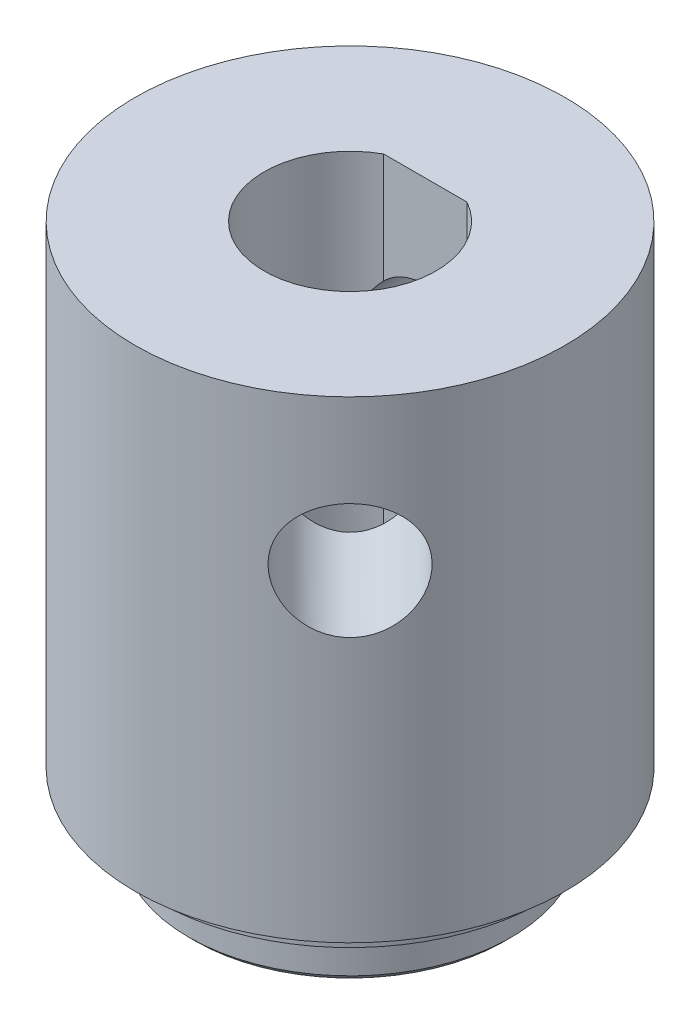
ISO-10303-21;
HEADER;
FILE_DESCRIPTION(('STEP AP214'),'2;1');
FILE_NAME('part.step','',(''),(''),'','','');
FILE_SCHEMA(('AUTOMOTIVE_DESIGN { 1 0 10303 214 1 1 1 1 }'));
ENDSEC;
DATA;
#1=APPLICATION_CONTEXT('core data for automotive mechanical design processes');
#2=APPLICATION_PROTOCOL_DEFINITION('international standard','automotive_design',2000,#1);
#3=PRODUCT_CONTEXT('',#1,'mechanical');
#4=PRODUCT('Part','Part','',(#3));
#5=PRODUCT_RELATED_PRODUCT_CATEGORY('part','',(#4));
#6=PRODUCT_DEFINITION_FORMATION('','',#4);
#7=PRODUCT_DEFINITION_CONTEXT('part definition',#1,'design');
#8=PRODUCT_DEFINITION('design','',#6,#7);
#9=PRODUCT_DEFINITION_SHAPE('','',#8);
#10=(LENGTH_UNIT() NAMED_UNIT(*) SI_UNIT(.MILLI.,.METRE.));
#11=(NAMED_UNIT(*) PLANE_ANGLE_UNIT() SI_UNIT($,.RADIAN.));
#12=(NAMED_UNIT(*) SI_UNIT($,.STERADIAN.) SOLID_ANGLE_UNIT());
#13=UNCERTAINTY_MEASURE_WITH_UNIT(LENGTH_MEASURE(1.E-05),#10,'distance_accuracy_value','');
#14=(GEOMETRIC_REPRESENTATION_CONTEXT(3) GLOBAL_UNCERTAINTY_ASSIGNED_CONTEXT((#13)) GLOBAL_UNIT_ASSIGNED_CONTEXT((#10,
#11,#12)) REPRESENTATION_CONTEXT('',''));
#15=CARTESIAN_POINT('',(0.,0.,0.));
#16=DIRECTION('',(0.,0.,1.));
#17=DIRECTION('',(1.,0.,0.));
#18=AXIS2_PLACEMENT_3D('',#15,#16,#17);
#19=CARTESIAN_POINT('',(-1.93649167310371,6.4,-3.5));
#20=DIRECTION('',(0.,0.,-1.));
#21=DIRECTION('',(-1.,0.,0.));
#22=AXIS2_PLACEMENT_3D('',#19,#20,#21);
#23=PLANE('',#22);
#24=DIRECTION('',(0.,1.,0.));
#25=VECTOR('',#24,1.);
#26=CARTESIAN_POINT('',(-1.93649167310371,6.4,-3.5));
#27=LINE('',#26,#25);
#28=CARTESIAN_POINT('',(-1.93649167310371,20.2814887722227,-3.5));
#29=VERTEX_POINT('',#28);
#30=CARTESIAN_POINT('',(-1.93649167310371,25.4,-3.5));
#31=VERTEX_POINT('',#30);
#32=EDGE_CURVE('E99',#29,#31,#27,.T.);
#33=ORIENTED_EDGE('',*,*,#32,.F.);
#34=CARTESIAN_POINT('',(0.,18.4,-3.5));
#35=DIRECTION('',(0.,0.,-1.));
#36=DIRECTION('',(-1.,0.,0.));
#37=AXIS2_PLACEMENT_3D('',#34,#35,#36);
#38=CIRCLE('',#37,2.7);
#39=CARTESIAN_POINT('',(1.93649167310371,20.2814887722227,-3.5));
#40=VERTEX_POINT('',#39);
#41=EDGE_CURVE('E85',#29,#40,#38,.T.);
#42=ORIENTED_EDGE('',*,*,#41,.T.);
#43=DIRECTION('',(0.,1.,0.));
#44=VECTOR('',#43,1.);
#45=CARTESIAN_POINT('',(1.93649167310371,6.4,-3.5));
#46=LINE('',#45,#44);
#47=CARTESIAN_POINT('',(1.93649167310371,25.4,-3.5));
#48=VERTEX_POINT('',#47);
#49=EDGE_CURVE('E60',#40,#48,#46,.T.);
#50=ORIENTED_EDGE('',*,*,#49,.T.);
#51=DIRECTION('',(-1.,0.,0.));
#52=VECTOR('',#51,1.);
#53=CARTESIAN_POINT('',(-1.93649167310371,25.4,-3.5));
#54=LINE('',#53,#52);
#55=EDGE_CURVE('E251',#48,#31,#54,.T.);
#56=ORIENTED_EDGE('',*,*,#55,.T.);
#57=EDGE_LOOP('',(#33,#42,#50,#56));
#58=FACE_BOUND('',#57,.T.);
#59=ADVANCED_FACE('F36',(#58),#23,.F.);
#60=CARTESIAN_POINT('',(0.,2.5,0.));
#61=DIRECTION('',(0.,-1.,0.));
#62=DIRECTION('',(0.,0.,-1.));
#63=AXIS2_PLACEMENT_3D('',#60,#61,#62);
#64=CYLINDRICAL_SURFACE('',#63,7.5);
#65=CARTESIAN_POINT('',(0.,0.299999999999992,0.));
#66=DIRECTION('',(0.,1.,0.));
#67=DIRECTION('',(0.,0.,1.));
#68=AXIS2_PLACEMENT_3D('',#65,#66,#67);
#69=CIRCLE('',#68,7.5);
#70=CARTESIAN_POINT('',(0.,0.299999999999992,7.5));
#71=VERTEX_POINT('',#70);
#72=EDGE_CURVE('E45',#71,#71,#69,.T.);
#73=ORIENTED_EDGE('',*,*,#72,.T.);
#74=EDGE_LOOP('',(#73));
#75=FACE_BOUND('',#74,.T.);
#76=CARTESIAN_POINT('',(0.,2.5,0.));
#77=DIRECTION('',(0.,1.,0.));
#78=DIRECTION('',(0.,0.,1.));
#79=AXIS2_PLACEMENT_3D('',#76,#77,#78);
#80=CIRCLE('',#79,7.5);
#81=CARTESIAN_POINT('',(0.,2.5,7.5));
#82=VERTEX_POINT('',#81);
#83=EDGE_CURVE('E86',#82,#82,#80,.T.);
#84=ORIENTED_EDGE('',*,*,#83,.F.);
#85=EDGE_LOOP('',(#84));
#86=FACE_BOUND('',#85,.T.);
#87=ADVANCED_FACE('F199',(#75,#86),#64,.T.);
#88=CARTESIAN_POINT('',(0.,0.,0.));
#89=DIRECTION('',(0.,1.,0.));
#90=DIRECTION('',(0.,0.,1.));
#91=AXIS2_PLACEMENT_3D('',#88,#89,#90);
#92=PLANE('',#91);
#93=CARTESIAN_POINT('',(0.,0.,0.));
#94=DIRECTION('',(0.,1.,0.));
#95=DIRECTION('',(0.,0.,1.));
#96=AXIS2_PLACEMENT_3D('',#93,#94,#95);
#97=CIRCLE('',#96,7.20000000000001);
#98=CARTESIAN_POINT('',(0.,0.,7.20000000000001));
#99=VERTEX_POINT('',#98);
#100=EDGE_CURVE('E11',#99,#99,#97,.F.);
#101=ORIENTED_EDGE('',*,*,#100,.T.);
#102=EDGE_LOOP('',(#101));
#103=FACE_BOUND('',#102,.T.);
#104=CARTESIAN_POINT('',(3.6,0.,0.));
#105=DIRECTION('',(0.,-1.,0.));
#106=DIRECTION('',(0.,0.,-1.));
#107=AXIS2_PLACEMENT_3D('',#104,#105,#106);
#108=CIRCLE('',#107,2.7);
#109=CARTESIAN_POINT('',(3.6,0.,-2.7));
#110=VERTEX_POINT('',#109);
#111=EDGE_CURVE('E109',#110,#110,#108,.T.);
#112=ORIENTED_EDGE('',*,*,#111,.F.);
#113=EDGE_LOOP('',(#112));
#114=FACE_BOUND('',#113,.T.);
#115=CARTESIAN_POINT('',(-3.6,0.,0.));
#116=DIRECTION('',(0.,-1.,0.));
#117=DIRECTION('',(0.,0.,-1.));
#118=AXIS2_PLACEMENT_3D('',#115,#116,#117);
#119=CIRCLE('',#118,2.7);
#120=CARTESIAN_POINT('',(-3.6,0.,-2.7));
#121=VERTEX_POINT('',#120);
#122=EDGE_CURVE('E115',#121,#121,#119,.T.);
#123=ORIENTED_EDGE('',*,*,#122,.F.);
#124=EDGE_LOOP('',(#123));
#125=FACE_BOUND('',#124,.T.);
#126=ADVANCED_FACE('F196',(#103,#114,#125),#92,.F.);
#127=CARTESIAN_POINT('',(0.,3.4,0.));
#128=DIRECTION('',(0.,-1.,0.));
#129=DIRECTION('',(0.,0.,-1.));
#130=AXIS2_PLACEMENT_3D('',#127,#128,#129);
#131=CYLINDRICAL_SURFACE('',#130,9.);
#132=CARTESIAN_POINT('',(0.,3.4,0.));
#133=DIRECTION('',(0.,1.,0.));
#134=DIRECTION('',(0.,0.,1.));
#135=AXIS2_PLACEMENT_3D('',#132,#133,#134);
#136=CIRCLE('',#135,9.);
#137=CARTESIAN_POINT('',(0.,3.4,9.));
#138=VERTEX_POINT('',#137);
#139=EDGE_CURVE('E124',#138,#138,#136,.T.);
#140=ORIENTED_EDGE('',*,*,#139,.F.);
#141=EDGE_LOOP('',(#140));
#142=FACE_BOUND('',#141,.T.);
#143=CARTESIAN_POINT('',(0.,2.5,0.));
#144=DIRECTION('',(0.,1.,0.));
#145=DIRECTION('',(0.,0.,1.));
#146=AXIS2_PLACEMENT_3D('',#143,#144,#145);
#147=CIRCLE('',#146,9.);
#148=CARTESIAN_POINT('',(0.,2.5,9.));
#149=VERTEX_POINT('',#148);
#150=EDGE_CURVE('E121',#149,#149,#147,.T.);
#151=ORIENTED_EDGE('',*,*,#150,.T.);
#152=EDGE_LOOP('',(#151));
#153=FACE_BOUND('',#152,.T.);
#154=ADVANCED_FACE('F192',(#142,#153),#131,.T.);
#155=CARTESIAN_POINT('',(0.,2.5,0.));
#156=DIRECTION('',(0.,1.,0.));
#157=DIRECTION('',(0.,0.,1.));
#158=AXIS2_PLACEMENT_3D('',#155,#156,#157);
#159=PLANE('',#158);
#160=ORIENTED_EDGE('',*,*,#83,.T.);
#161=EDGE_LOOP('',(#160));
#162=FACE_BOUND('',#161,.T.);
#163=ORIENTED_EDGE('',*,*,#150,.F.);
#164=EDGE_LOOP('',(#163));
#165=FACE_BOUND('',#164,.T.);
#166=ADVANCED_FACE('F186',(#162,#165),#159,.F.);
#167=CARTESIAN_POINT('',(0.,25.4,0.));
#168=DIRECTION('',(0.,-1.,0.));
#169=DIRECTION('',(0.,0.,-1.));
#170=AXIS2_PLACEMENT_3D('',#167,#168,#169);
#171=CYLINDRICAL_SURFACE('',#170,10.);
#172=CARTESIAN_POINT('',(7.07106781186544,21.1,7.07106781186551));
#173=CARTESIAN_POINT('',(7.17626584744372,21.0999966134414,6.9658667033576));
#174=CARTESIAN_POINT('',(7.27912172257725,21.0876622005278,6.85827250792244));
#175=CARTESIAN_POINT('',(7.47731654245444,21.0387405728475,6.64163600158833));
#176=CARTESIAN_POINT('',(7.5726519792952,21.0021421141151,6.53259304229989));
#177=CARTESIAN_POINT('',(7.75353818130227,20.9059723924098,6.3168386634154));
#178=CARTESIAN_POINT('',(7.83910154996799,20.8464311636822,6.21012438753666));
#179=CARTESIAN_POINT('',(7.99919218506858,20.7061785469694,6.00251052747785));
#180=CARTESIAN_POINT('',(8.07371864223066,20.6254656077865,5.90161137001775));
#181=CARTESIAN_POINT('',(8.21239835917292,20.4431398463246,5.70710949350534));
#182=CARTESIAN_POINT('',(8.27629649161368,20.3411180031739,5.61370827906879));
#183=CARTESIAN_POINT('',(8.39133318491968,20.1199445551797,5.4402557599493));
#184=CARTESIAN_POINT('',(8.44247005923075,20.0007906894092,5.36020622031433));
#185=CARTESIAN_POINT('',(8.53260547901079,19.746143587175,5.21555916745932));
#186=CARTESIAN_POINT('',(8.5713736325264,19.6103988883898,5.15125960834112));
#187=CARTESIAN_POINT('',(8.63544685358845,19.3280164996318,5.04311770400875));
#188=CARTESIAN_POINT('',(8.66075447324025,19.1813808805806,4.99927148105403));
#189=CARTESIAN_POINT('',(8.69745584478401,18.8849600557728,4.93514016078787));
#190=CARTESIAN_POINT('',(8.70915769087388,18.7353259983278,4.91433388015705));
#191=CARTESIAN_POINT('',(8.71967625520028,18.4341975932172,4.8956481420698));
#192=CARTESIAN_POINT('',(8.71849544675589,18.2827036082145,4.89776428377569));
#193=CARTESIAN_POINT('',(8.70347622879877,17.9867502698382,4.92439963874229));
#194=CARTESIAN_POINT('',(8.69000125595425,17.842213701612,4.94827557295524));
#195=CARTESIAN_POINT('',(8.65092047642879,17.5597035119891,5.01628329914941));
#196=CARTESIAN_POINT('',(8.62531367850369,17.4217304278829,5.0604167462839));
#197=CARTESIAN_POINT('',(8.56163093462451,17.1544191827971,5.16743419572102));
#198=CARTESIAN_POINT('',(8.52341474798065,17.0251988010188,5.2305283390812));
#199=CARTESIAN_POINT('',(8.43465315147887,16.7803641680942,5.37248694506347));
#200=CARTESIAN_POINT('',(8.38410525946301,16.6647526631323,5.45135458203903));
#201=CARTESIAN_POINT('',(8.26893591366137,16.4463531278058,5.62457561955126));
#202=CARTESIAN_POINT('',(8.20389998763213,16.3441239194951,5.71935903125733));
#203=CARTESIAN_POINT('',(8.06126328524319,16.1599521691682,5.91870196307991));
#204=CARTESIAN_POINT('',(7.98366198893985,16.0780104669858,6.02326188766396));
#205=CARTESIAN_POINT('',(7.81642567352215,15.9364850866254,6.23876200794529));
#206=CARTESIAN_POINT('',(7.72673757607034,15.8770046940274,6.34972903636391));
#207=CARTESIAN_POINT('',(7.53724114049325,15.7829033274503,6.57354275367459));
#208=CARTESIAN_POINT('',(7.43743507703852,15.7482767800358,6.68638901534022));
#209=CARTESIAN_POINT('',(7.23321697295564,15.7057484496526,6.90669704073499));
#210=CARTESIAN_POINT('',(7.12902820737294,15.6970871447329,7.01421937659785));
#211=CARTESIAN_POINT('',(6.91636133105645,15.7046346697499,7.22400497600785));
#212=CARTESIAN_POINT('',(6.80788367687358,15.7208408594562,7.32626879667044));
#213=CARTESIAN_POINT('',(6.59199834767966,15.7770410899257,7.52105984151397));
#214=CARTESIAN_POINT('',(6.48460565468709,15.8166095745997,7.61372722302914));
#215=CARTESIAN_POINT('',(6.27244765441752,15.9179153272779,7.7894409859987));
#216=CARTESIAN_POINT('',(6.16768263679884,15.9796550279062,7.87248631039873));
#217=CARTESIAN_POINT('',(5.96224293221841,16.1249465280608,8.02924041526226));
#218=CARTESIAN_POINT('',(5.86169157546945,16.2089089798073,8.10272983143563));
#219=CARTESIAN_POINT('',(5.67053899657533,16.3957480567446,8.23763913764193));
#220=CARTESIAN_POINT('',(5.57993979694645,16.4986285152093,8.29905657635481));
#221=CARTESIAN_POINT('',(5.4096960510774,16.7239307265284,8.41105753182777));
#222=CARTESIAN_POINT('',(5.33044480222744,16.8468321672722,8.46127572924663));
#223=CARTESIAN_POINT('',(5.18960160418994,17.1066892226475,8.54838692510641));
#224=CARTESIAN_POINT('',(5.12800893393623,17.2436442631074,8.58528046765909));
#225=CARTESIAN_POINT('',(5.02579159292412,17.5270534921737,8.64551564592648));
#226=CARTESIAN_POINT('',(4.98504685464814,17.6734476909727,8.6689349818587));
#227=CARTESIAN_POINT('',(4.92618983147804,17.9721760434972,8.70251824865256));
#228=CARTESIAN_POINT('',(4.90807158451387,18.1245086215479,8.71268567141807));
#229=CARTESIAN_POINT('',(4.89570098448458,18.42529040598,8.71964188089305));
#230=CARTESIAN_POINT('',(4.90066633612365,18.5736978758993,8.71686919100633));
#231=CARTESIAN_POINT('',(4.93240625451066,18.8673896781182,8.6989478563701));
#232=CARTESIAN_POINT('',(4.9591802329989,19.0126740945497,8.68379954543702));
#233=CARTESIAN_POINT('',(5.03282586181659,19.2948785038092,8.641321368078));
#234=CARTESIAN_POINT('',(5.07953257925972,19.4318568290476,8.61409139922188));
#235=CARTESIAN_POINT('',(5.19079441531473,19.6952023690193,8.54750478054823));
#236=CARTESIAN_POINT('',(5.25535239748577,19.8215678770847,8.50814618503601));
#237=CARTESIAN_POINT('',(5.40173298493354,20.0642105262596,8.41599445736024));
#238=CARTESIAN_POINT('',(5.48401689737994,20.1800693442376,8.36283249558742));
#239=CARTESIAN_POINT('',(5.66124617249596,20.3943511890154,8.24388635833899));
#240=CARTESIAN_POINT('',(5.75619462571469,20.4927699461937,8.17809910016618));
#241=CARTESIAN_POINT('',(5.95735686187266,20.6715188651449,8.03278360252125));
#242=CARTESIAN_POINT('',(6.06377321709943,20.751401256519,7.95298384568201));
#243=CARTESIAN_POINT('',(6.28201962296779,20.887770978436,7.78173570178111));
#244=CARTESIAN_POINT('',(6.39384623707061,20.9442729476066,7.69029465045231));
#245=CARTESIAN_POINT('',(6.60106853383742,21.0251229094896,7.51275517459323));
#246=CARTESIAN_POINT('',(6.69627537649812,21.0531356206694,7.42808698128447));
#247=CARTESIAN_POINT('',(6.88527444404049,21.0905746783866,7.25324485454093));
#248=CARTESIAN_POINT('',(6.97906681532143,21.1000029617166,7.16307149584172));
#249=CARTESIAN_POINT('',(7.07106781186544,21.1,7.07106781186551));
#250=B_SPLINE_CURVE_WITH_KNOTS('',3,(#172,#173,#174,#175,#176,#177,#178,#179,#180,#181,#182,
#183,#184,#185,#186,#187,#188,#189,#190,#191,#192,#193,#194,#195,#196,#197,#198,#199,#200,#201,
#202,#203,#204,#205,#206,#207,#208,#209,#210,#211,#212,#213,#214,#215,#216,#217,#218,#219,#220,
#221,#222,#223,#224,#225,#226,#227,#228,#229,#230,#231,#232,#233,#234,#235,#236,#237,#238,#239,
#240,#241,#242,#243,#244,#245,#246,#247,#248,#249),.UNSPECIFIED.,.T.,.F.,(4,2,2,2,2,2,2,2,2,2,2,
2,2,2,2,2,2,2,2,2,2,2,2,2,2,2,2,2,2,2,2,2,2,2,2,2,2,2,4),(0.,0.445846761667101,
0.891900273397315,1.33737183210164,1.78287603849986,2.23788152875122,2.69294712165627,
3.1560518071867,3.61906865714872,4.07138297844435,4.52361046220637,4.96288777079238,
5.40220097720711,5.84657486439827,6.29103827023387,6.75038019248412,7.20974112674609,
7.67118937307152,8.13253410800248,8.5802453367549,9.02790903442271,9.46765948757278,
9.9074582048594,10.3560325750265,10.8046979382342,11.2663584986382,11.7280002050194,
12.1869524199218,12.6457836755925,13.0891808581579,13.5325660810498,13.9723515673492,
14.4122076415361,14.8653077300238,15.3185185922744,15.7817442781461,16.2446794950919,
16.634635653384,17.024551169903),.UNSPECIFIED.);
#251=CARTESIAN_POINT('',(7.07106781186544,21.1,7.07106781186551));
#252=VERTEX_POINT('',#251);
#253=EDGE_CURVE('E150',#252,#252,#250,.T.);
#254=ORIENTED_EDGE('',*,*,#253,.T.);
#255=EDGE_LOOP('',(#254));
#256=FACE_BOUND('',#255,.T.);
#257=CARTESIAN_POINT('',(0.,21.1,-10.));
#258=CARTESIAN_POINT('',(-0.148774661539189,21.0999966134414,-9.99999782711062));
#259=CARTESIAN_POINT('',(-0.297585333539505,21.0876622005278,-9.9966473286939));
#260=CARTESIAN_POINT('',(-0.590915377352119,21.0387405728475,-9.9836070871437));
#261=CARTESIAN_POINT('',(-0.735432727183111,21.0021421141151,-9.97391440506767));
#262=CARTESIAN_POINT('',(-1.0158999716253,20.9059723924098,-9.94925888075004));
#263=CARTESIAN_POINT('',(-1.15186079795326,20.8464311636822,-9.93430293083146));
#264=CARTESIAN_POINT('',(-1.41186713995325,20.7061785469694,-9.90069893619965));
#265=CARTESIAN_POINT('',(-1.53591178164641,20.6254656077865,-9.88205062098072));
#266=CARTESIAN_POINT('',(-1.77150674574475,20.4431398463246,-9.84257839340819));
#267=CARTESIAN_POINT('',(-1.88273418059791,20.3411180031739,-9.82171656406306));
#268=CARTESIAN_POINT('',(-2.08672685900314,20.1199445551797,-9.78041033750172));
#269=CARTESIAN_POINT('',(-2.17948966190393,20.0007906894092,-9.75996599578902));
#270=CARTESIAN_POINT('',(-2.34550594040793,19.746143587175,-9.72142045038815));
#271=CARTESIAN_POINT('',(-2.41838581893267,19.6103988883898,-9.70336702035334));
#272=CARTESIAN_POINT('',(-2.54016030192196,19.3280164996318,-9.67220575557493));
#273=CARTESIAN_POINT('',(-2.58905945297414,19.1813808805806,-9.65909698346571));
#274=CARTESIAN_POINT('',(-2.66035893311823,18.8849600557728,-9.63970108071651));
#275=CARTESIAN_POINT('',(-2.68334564996609,18.7353259983278,-9.63326327331372));
#276=CARTESIAN_POINT('',(-2.70399621024262,18.4341975932172,-9.6274882093643));
#277=CARTESIAN_POINT('',(-2.70166491443412,18.2827036082145,-9.62814958985618));
#278=CARTESIAN_POINT('',(-2.67221068345232,17.9867502698382,-9.63636343910678));
#279=CARTESIAN_POINT('',(-2.64579960378852,17.842213701612,-9.64371802942125));
#280=CARTESIAN_POINT('',(-2.57007659520703,17.5597035119891,-9.66417246956972));
#281=CARTESIAN_POINT('',(-2.52076279500379,17.4217304278829,-9.67727278885835));
#282=CARTESIAN_POINT('',(-2.40005953075998,17.1544191827971,-9.70791505301908));
#283=CARTESIAN_POINT('',(-2.32842230940987,17.0251988010188,-9.72550642491526));
#284=CARTESIAN_POINT('',(-2.16527848967667,16.7803641680942,-9.76312239105776));
#285=CARTESIAN_POINT('',(-2.07376789153599,16.6647526631323,-9.78314747476023));
#286=CARTESIAN_POINT('',(-1.86984509586576,16.4463531278058,-9.82419621962814));
#287=CARTESIAN_POINT('',(-1.75683575838838,16.3441239194951,-9.84523086847349));
#288=CARTESIAN_POINT('',(-1.51501964000972,16.1599521691682,-9.88532822784153));
#289=CARTESIAN_POINT('',(-1.38621220545103,16.0780104669858,-9.90439085671031));
#290=CARTESIAN_POINT('',(-1.11557667636108,15.9364850866254,-9.93851852041525));
#291=CARTESIAN_POINT('',(-0.973692076178253,15.8770046940274,-9.95356499679829));
#292=CARTESIAN_POINT('',(-0.681437664338065,15.7829033274503,-9.97783097942399));
#293=CARTESIAN_POINT('',(-0.531069763210368,15.7482767800358,-9.98705179200694));
#294=CARTESIAN_POINT('',(-0.230884458265848,15.7057484496526,-9.99842908447533));
#295=CARTESIAN_POINT('',(-0.0811821027812213,15.6970871447329,-10.000786274626));
#296=CARTESIAN_POINT('',(0.217536907534027,15.7046346697499,-9.99874890418695));
#297=CARTESIAN_POINT('',(0.366553633474502,15.7208408594562,-9.99435506036759));
#298=CARTESIAN_POINT('',(0.656945682429491,15.7770410899257,-9.97943914885916));
#299=CARTESIAN_POINT('',(0.798409517758601,15.8166095745997,-9.96902678125841));
#300=CARTESIAN_POINT('',(1.07267627177577,15.9179153272779,-9.9432568139284));
#301=CARTESIAN_POINT('',(1.20547823819417,15.9796550279062,-9.92789867156819));
#302=CARTESIAN_POINT('',(1.46158793695578,16.1249465280608,-9.89347275386225));
#303=CARTESIAN_POINT('',(1.58465334769211,16.2089089798073,-9.87433707216918));
#304=CARTESIAN_POINT('',(1.81521391773308,16.3957480567446,-9.8345670726555));
#305=CARTESIAN_POINT('',(1.92270591355772,16.4986285152093,-9.81393245162483));
#306=CARTESIAN_POINT('',(2.12228305583063,16.7239307265284,-9.77274857958053));
#307=CARTESIAN_POINT('',(2.21383177924378,16.8468321672722,-9.75221911203506));
#308=CARTESIAN_POINT('',(2.37501987696982,17.1066892226475,-9.71422484892847));
#309=CARTESIAN_POINT('',(2.44466014589859,17.2436442631074,-9.69675992824168));
#310=CARTESIAN_POINT('',(2.55953142390197,17.5270534921737,-9.66707405627601));
#311=CARTESIAN_POINT('',(2.60490227588315,17.6734476909727,-9.65482314679195));
#312=CARTESIAN_POINT('',(2.67026743177151,17.9721760434972,-9.63695190227225));
#313=CARTESIAN_POINT('',(2.69026842064778,18.1245086215479,-9.63132982056536));
#314=CARTESIAN_POINT('',(2.70393453870694,18.42529040598,-9.62750126828841));
#315=CARTESIAN_POINT('',(2.69846291707096,18.5736978758993,-9.62905171428235));
#316=CARTESIAN_POINT('',(2.663347108296,18.8673896781182,-9.63882292855892));
#317=CARTESIAN_POINT('',(2.63370357316332,19.0126740945497,-9.647043516923));
#318=CARTESIAN_POINT('',(2.55159164235857,19.2948785038092,-9.66908223320172));
#319=CARTESIAN_POINT('',(2.49931051009791,19.4318568290476,-9.68285437420306));
#320=CARTESIAN_POINT('',(2.37355266173573,19.6952023690193,-9.71444452336441));
#321=CARTESIAN_POINT('',(2.3000725449782,19.8215678770847,-9.7322631805526));
#322=CARTESIAN_POINT('',(2.13140472742222,20.0642105262596,-9.77060877503339));
#323=CARTESIAN_POINT('',(2.03563003127806,20.1800693442376,-9.79120110383606));
#324=CARTESIAN_POINT('',(1.82620238877444,20.3943511890154,-9.83241350585106));
#325=CARTESIAN_POINT('',(1.71254507727064,20.4927699461937,-9.85303358461553));
#326=CARTESIAN_POINT('',(1.46754832216846,20.6715188651449,-9.89252319212526));
#327=CARTESIAN_POINT('',(1.33587364656039,20.751401256519,-9.9113439693372));
#328=CARTESIAN_POINT('',(1.06045940918335,20.887770978436,-9.94457675907837));
#329=CARTESIAN_POINT('',(0.916727464560685,20.9442729476066,-9.95899152875418));
#330=CARTESIAN_POINT('',(0.644659805995566,21.0251229094896,-9.97998045270278));
#331=CARTESIAN_POINT('',(0.517468948295386,21.0531356206694,-9.98743240312409));
#332=CARTESIAN_POINT('',(0.260194372540812,21.0905746783866,-9.99744287196379));
#333=CARTESIAN_POINT('',(0.130110957365907,21.1000029617166,-10.0000019003015));
#334=CARTESIAN_POINT('',(0.,21.1,-10.));
#335=B_SPLINE_CURVE_WITH_KNOTS('',3,(#257,#258,#259,#260,#261,#262,#263,#264,#265,#266,#267,
#268,#269,#270,#271,#272,#273,#274,#275,#276,#277,#278,#279,#280,#281,#282,#283,#284,#285,#286,
#287,#288,#289,#290,#291,#292,#293,#294,#295,#296,#297,#298,#299,#300,#301,#302,#303,#304,#305,
#306,#307,#308,#309,#310,#311,#312,#313,#314,#315,#316,#317,#318,#319,#320,#321,#322,#323,#324,
#325,#326,#327,#328,#329,#330,#331,#332,#333,#334),.UNSPECIFIED.,.T.,.F.,(4,2,2,2,2,2,2,2,2,2,2,
2,2,2,2,2,2,2,2,2,2,2,2,2,2,2,2,2,2,2,2,2,2,2,2,2,2,2,4),(0.,0.445846761667101,
0.891900273397315,1.33737183210164,1.78287603849986,2.23788152875122,2.69294712165627,
3.1560518071867,3.61906865714872,4.07138297844435,4.52361046220637,4.96288777079238,
5.40220097720711,5.84657486439827,6.29103827023387,6.75038019248411,7.20974112674609,
7.67118937307152,8.13253410800249,8.58024533675491,9.02790903442271,9.46765948757278,
9.9074582048594,10.3560325750265,10.8046979382342,11.2663584986382,11.7280002050194,
12.1869524199218,12.6457836755925,13.0891808581579,13.5325660810498,13.9723515673492,
14.4122076415361,14.8653077300238,15.3185185922744,15.7817442781461,16.2446794950919,
16.634635653384,17.024551169903),.UNSPECIFIED.);
#336=CARTESIAN_POINT('',(0.,21.1,-10.));
#337=VERTEX_POINT('',#336);
#338=EDGE_CURVE('E93',#337,#337,#335,.T.);
#339=ORIENTED_EDGE('',*,*,#338,.T.);
#340=EDGE_LOOP('',(#339));
#341=FACE_BOUND('',#340,.T.);
#342=CARTESIAN_POINT('',(0.,25.4,0.));
#343=DIRECTION('',(0.,1.,0.));
#344=DIRECTION('',(0.,0.,1.));
#345=AXIS2_PLACEMENT_3D('',#342,#343,#344);
#346=CIRCLE('',#345,10.);
#347=CARTESIAN_POINT('',(0.,25.4,10.));
#348=VERTEX_POINT('',#347);
#349=EDGE_CURVE('E118',#348,#348,#346,.T.);
#350=ORIENTED_EDGE('',*,*,#349,.F.);
#351=EDGE_LOOP('',(#350));
#352=FACE_BOUND('',#351,.T.);
#353=CARTESIAN_POINT('',(0.,3.4,0.));
#354=DIRECTION('',(0.,1.,0.));
#355=DIRECTION('',(0.,0.,1.));
#356=AXIS2_PLACEMENT_3D('',#353,#354,#355);
#357=CIRCLE('',#356,10.);
#358=CARTESIAN_POINT('',(0.,3.4,10.));
#359=VERTEX_POINT('',#358);
#360=EDGE_CURVE('E108',#359,#359,#357,.T.);
#361=ORIENTED_EDGE('',*,*,#360,.T.);
#362=EDGE_LOOP('',(#361));
#363=FACE_BOUND('',#362,.T.);
#364=ADVANCED_FACE('F180',(#256,#341,#352,#363),#171,.T.);
#365=CARTESIAN_POINT('',(0.,25.4,0.));
#366=DIRECTION('',(0.,1.,0.));
#367=DIRECTION('',(0.,0.,1.));
#368=AXIS2_PLACEMENT_3D('',#365,#366,#367);
#369=PLANE('',#368);
#370=CARTESIAN_POINT('',(0.,25.4,0.));
#371=DIRECTION('',(0.,1.,0.));
#372=DIRECTION('',(0.,0.,1.));
#373=AXIS2_PLACEMENT_3D('',#370,#371,#372);
#374=CIRCLE('',#373,4.);
#375=EDGE_CURVE('E177',#31,#48,#374,.T.);
#376=ORIENTED_EDGE('',*,*,#375,.F.);
#377=ORIENTED_EDGE('',*,*,#55,.F.);
#378=EDGE_LOOP('',(#376,#377));
#379=FACE_BOUND('',#378,.T.);
#380=ORIENTED_EDGE('',*,*,#349,.T.);
#381=EDGE_LOOP('',(#380));
#382=FACE_BOUND('',#381,.T.);
#383=ADVANCED_FACE('F185',(#379,#382),#369,.T.);
#384=CARTESIAN_POINT('',(0.,3.4,0.));
#385=DIRECTION('',(0.,1.,0.));
#386=DIRECTION('',(0.,0.,1.));
#387=AXIS2_PLACEMENT_3D('',#384,#385,#386);
#388=PLANE('',#387);
#389=ORIENTED_EDGE('',*,*,#139,.T.);
#390=EDGE_LOOP('',(#389));
#391=FACE_BOUND('',#390,.T.);
#392=ORIENTED_EDGE('',*,*,#360,.F.);
#393=EDGE_LOOP('',(#392));
#394=FACE_BOUND('',#393,.T.);
#395=ADVANCED_FACE('F188',(#391,#394),#388,.F.);
#396=CARTESIAN_POINT('',(-3.6,5.5,0.));
#397=DIRECTION('',(0.,-1.,0.));
#398=DIRECTION('',(0.,0.,-1.));
#399=AXIS2_PLACEMENT_3D('',#396,#397,#398);
#400=CYLINDRICAL_SURFACE('',#399,2.7);
#401=CARTESIAN_POINT('',(-3.6,5.5,0.));
#402=DIRECTION('',(0.,-1.,0.));
#403=DIRECTION('',(0.,0.,-1.));
#404=AXIS2_PLACEMENT_3D('',#401,#402,#403);
#405=CIRCLE('',#404,2.7);
#406=CARTESIAN_POINT('',(-3.6,5.5,-2.7));
#407=VERTEX_POINT('',#406);
#408=EDGE_CURVE('E112',#407,#407,#405,.T.);
#409=ORIENTED_EDGE('',*,*,#408,.F.);
#410=EDGE_LOOP('',(#409));
#411=FACE_BOUND('',#410,.T.);
#412=ORIENTED_EDGE('',*,*,#122,.T.);
#413=EDGE_LOOP('',(#412));
#414=FACE_BOUND('',#413,.T.);
#415=ADVANCED_FACE('F224',(#411,#414),#400,.F.);
#416=CARTESIAN_POINT('',(-3.6,5.5,0.));
#417=DIRECTION('',(0.,-1.,0.));
#418=DIRECTION('',(0.,0.,-1.));
#419=AXIS2_PLACEMENT_3D('',#416,#417,#418);
#420=PLANE('',#419);
#421=ORIENTED_EDGE('',*,*,#408,.T.);
#422=EDGE_LOOP('',(#421));
#423=FACE_BOUND('',#422,.T.);
#424=ADVANCED_FACE('F226',(#423),#420,.T.);
#425=CARTESIAN_POINT('',(3.6,5.5,0.));
#426=DIRECTION('',(0.,-1.,0.));
#427=DIRECTION('',(0.,0.,-1.));
#428=AXIS2_PLACEMENT_3D('',#425,#426,#427);
#429=CYLINDRICAL_SURFACE('',#428,2.7);
#430=CARTESIAN_POINT('',(3.6,5.5,0.));
#431=DIRECTION('',(0.,-1.,0.));
#432=DIRECTION('',(0.,0.,-1.));
#433=AXIS2_PLACEMENT_3D('',#430,#431,#432);
#434=CIRCLE('',#433,2.7);
#435=CARTESIAN_POINT('',(3.6,5.5,-2.7));
#436=VERTEX_POINT('',#435);
#437=EDGE_CURVE('E105',#436,#436,#434,.T.);
#438=ORIENTED_EDGE('',*,*,#437,.F.);
#439=EDGE_LOOP('',(#438));
#440=FACE_BOUND('',#439,.T.);
#441=ORIENTED_EDGE('',*,*,#111,.T.);
#442=EDGE_LOOP('',(#441));
#443=FACE_BOUND('',#442,.T.);
#444=ADVANCED_FACE('F233',(#440,#443),#429,.F.);
#445=CARTESIAN_POINT('',(3.6,5.5,0.));
#446=DIRECTION('',(0.,-1.,0.));
#447=DIRECTION('',(0.,0.,-1.));
#448=AXIS2_PLACEMENT_3D('',#445,#446,#447);
#449=PLANE('',#448);
#450=ORIENTED_EDGE('',*,*,#437,.T.);
#451=EDGE_LOOP('',(#450));
#452=FACE_BOUND('',#451,.T.);
#453=ADVANCED_FACE('F262',(#452),#449,.T.);
#454=CARTESIAN_POINT('',(0.,6.4,0.));
#455=DIRECTION('',(0.,1.,0.));
#456=DIRECTION('',(0.,0.,1.));
#457=AXIS2_PLACEMENT_3D('',#454,#455,#456);
#458=CYLINDRICAL_SURFACE('',#457,4.);
#459=CARTESIAN_POINT('',(0.17767536626722,18.4,3.9960519846746));
#460=CARTESIAN_POINT('',(0.177685962069094,18.2687277340167,3.99605499820363));
#461=CARTESIAN_POINT('',(0.19081253986627,18.1374246204249,3.99553288781149));
#462=CARTESIAN_POINT('',(0.241458132275288,17.8795596034868,3.99277994299646));
#463=CARTESIAN_POINT('',(0.279021838310097,17.7530068371324,3.99054597654065));
#464=CARTESIAN_POINT('',(0.373753626628826,17.5092056335187,3.98277735771585));
#465=CARTESIAN_POINT('',(0.43072470227831,17.3918777403924,3.9772754764287));
#466=CARTESIAN_POINT('',(0.560006710772697,17.1665071555508,3.96114069223527));
#467=CARTESIAN_POINT('',(0.632320350433505,17.0584661070017,3.95050688350482));
#468=CARTESIAN_POINT('',(0.801285583719427,16.8357615229338,3.9200033240736));
#469=CARTESIAN_POINT('',(0.899980346484063,16.7228119787875,3.89892643573464));
#470=CARTESIAN_POINT('',(1.1088949656785,16.5112285615959,3.84474324242882));
#471=CARTESIAN_POINT('',(1.21912753803706,16.4126107756749,3.81162356342663));
#472=CARTESIAN_POINT('',(1.46461902567489,16.2177186360277,3.72480868104571));
#473=CARTESIAN_POINT('',(1.60115177558928,16.124014236478,3.66877249536613));
#474=CARTESIAN_POINT('',(1.80883582528244,16.0023452573315,3.56848063042536));
#475=CARTESIAN_POINT('',(1.87853130532288,15.9649421188834,3.53235205153472));
#476=CARTESIAN_POINT('',(2.0180975538741,15.8969185477763,3.45451302072629));
#477=CARTESIAN_POINT('',(2.08796824218558,15.8662954392603,3.41280478138226));
#478=CARTESIAN_POINT('',(2.26120456220688,15.7991138050775,3.30182955125539));
#479=CARTESIAN_POINT('',(2.36415513965579,15.7670350279881,3.22909260524336));
#480=CARTESIAN_POINT('',(2.5649875427033,15.7208184956331,3.07198289270446));
#481=CARTESIAN_POINT('',(2.66287317329883,15.7066670792449,2.98761904061247));
#482=CARTESIAN_POINT('',(2.85059304507704,15.6970480577022,2.80907745586978));
#483=CARTESIAN_POINT('',(2.94041377697618,15.7016112254138,2.71488380782774));
#484=CARTESIAN_POINT('',(3.10925120486279,15.7292291799604,2.51976552313077));
#485=CARTESIAN_POINT('',(3.18826470392884,15.7522894246857,2.41883890785449));
#486=CARTESIAN_POINT('',(3.33271466132763,15.8150970313467,2.21547143149335));
#487=CARTESIAN_POINT('',(3.39836490385755,15.8545446852023,2.11308815784389));
#488=CARTESIAN_POINT('',(3.51751571414746,15.9483953264547,1.90817971249367));
#489=CARTESIAN_POINT('',(3.57101397742942,16.0028011461725,1.80565451758188));
#490=CARTESIAN_POINT('',(3.67177000408824,16.1317244938047,1.59173254404772));
#491=CARTESIAN_POINT('',(3.71764447883663,16.2078177961062,1.48063851938782));
#492=CARTESIAN_POINT('',(3.79652133277038,16.3744203017196,1.26477806429151));
#493=CARTESIAN_POINT('',(3.82950853587643,16.4649463255313,1.16001921608235));
#494=CARTESIAN_POINT('',(3.88907209101433,16.6751735654175,0.943265501917499));
#495=CARTESIAN_POINT('',(3.91365417172163,16.7972221305142,0.832989701456962));
#496=CARTESIAN_POINT('',(3.9512403249856,17.0575142529301,0.631057622927289));
#497=CARTESIAN_POINT('',(3.96425131399154,17.1957480797477,0.539390247271802));
#498=CARTESIAN_POINT('',(3.98032715491792,17.4523012417293,0.400828006016047));
#499=CARTESIAN_POINT('',(3.98502025680019,17.5675537031036,0.348470300665816));
#500=CARTESIAN_POINT('',(3.99157583667399,17.8050100708004,0.263015340288786));
#501=CARTESIAN_POINT('',(3.99344346376742,17.9272009099015,0.229883117157477));
#502=CARTESIAN_POINT('',(3.99572624990534,18.1766891660233,0.186251346241447));
#503=CARTESIAN_POINT('',(3.99612984662263,18.3040192374639,0.175932215479352));
#504=CARTESIAN_POINT('',(3.9959524589547,18.5582996636763,0.179905416906143));
#505=CARTESIAN_POINT('',(3.99537140962727,18.685249992849,0.194199372449196));
#506=CARTESIAN_POINT('',(3.99269361318158,18.920807735039,0.242647668860034));
#507=CARTESIAN_POINT('',(3.99076775559439,19.0299131207878,0.274484535033743));
#508=CARTESIAN_POINT('',(3.98455344412475,19.2423850676138,0.353410166551139));
#509=CARTESIAN_POINT('',(3.9802628533407,19.345746344866,0.400512710909165));
#510=CARTESIAN_POINT('',(3.96535591490873,19.5904802520215,0.530990207960626));
#511=CARTESIAN_POINT('',(3.95276576401027,19.7281148458175,0.621159123805704));
#512=CARTESIAN_POINT('',(3.91633121874616,19.9876423028625,0.82012945386927));
#513=CARTESIAN_POINT('',(3.89246611004151,20.1095056640864,0.928964926871619));
#514=CARTESIAN_POINT('',(3.82966110517331,20.337473408579,1.16119153892987));
#515=CARTESIAN_POINT('',(3.79052662831692,20.4433488659428,1.28475564848645));
#516=CARTESIAN_POINT('',(3.69413734778483,20.6348622101327,1.54009927567744));
#517=CARTESIAN_POINT('',(3.63691180519992,20.7205323896586,1.67186525285885));
#518=CARTESIAN_POINT('',(3.51422462914804,20.8551337163749,1.91449097962717));
#519=CARTESIAN_POINT('',(3.45205437311609,20.9078926848875,2.02488604385154));
#520=CARTESIAN_POINT('',(3.31372602397535,20.9953417178901,2.24409693484918));
#521=CARTESIAN_POINT('',(3.23757697906174,21.030043415099,2.35291373432147));
#522=CARTESIAN_POINT('',(3.07181565167214,21.079636253382,2.56557839971773));
#523=CARTESIAN_POINT('',(2.98214271212775,21.0944349991991,2.66940094801399));
#524=CARTESIAN_POINT('',(2.79204024079535,21.1029608172153,2.86763898611284));
#525=CARTESIAN_POINT('',(2.69161263829114,21.0966916626845,2.96205615730395));
#526=CARTESIAN_POINT('',(2.49174495444691,21.0648162872081,3.13162177036638));
#527=CARTESIAN_POINT('',(2.39283624560504,21.0407528932635,3.20769793029443));
#528=CARTESIAN_POINT('',(2.19208674245058,20.9763178156578,3.34809959538016));
#529=CARTESIAN_POINT('',(2.09024548221516,20.9359435271013,3.41242322124114));
#530=CARTESIAN_POINT('',(1.88118310096639,20.8379986057375,3.53220026264948));
#531=CARTESIAN_POINT('',(1.77396544366451,20.7796240177266,3.58699560838751));
#532=CARTESIAN_POINT('',(1.56263242720094,20.6485860310709,3.68398195129739));
#533=CARTESIAN_POINT('',(1.4585188234884,20.5759147172558,3.7261659336298));
#534=CARTESIAN_POINT('',(1.24006530468988,20.4054299158557,3.80496478963916));
#535=CARTESIAN_POINT('',(1.1267122995771,20.3054577901129,3.83964368429103));
#536=CARTESIAN_POINT('',(0.911745456540665,20.090286456332,3.89629129383371));
#537=CARTESIAN_POINT('',(0.810141493074136,19.9750746119434,3.91824937880274));
#538=CARTESIAN_POINT('',(0.628830817228096,19.7376698058073,3.95127342592069));
#539=CARTESIAN_POINT('',(0.548198030556488,19.6162649686326,3.96289547564363));
#540=CARTESIAN_POINT('',(0.406750654319128,19.3620294879661,3.97990459421932));
#541=CARTESIAN_POINT('',(0.345901625201137,19.2292192142556,3.98530254016893));
#542=CARTESIAN_POINT('',(0.259241849184689,18.9807424430232,3.99178192575177));
#543=CARTESIAN_POINT('',(0.228949750491741,18.8666719821261,3.99349259537478));
#544=CARTESIAN_POINT('',(0.188173396660447,18.6350731082177,3.9956255188195));
#545=CARTESIAN_POINT('',(0.177665878161908,18.5175489216351,3.99604928618315));
#546=CARTESIAN_POINT('',(0.17767536626722,18.4,3.9960519846746));
#547=B_SPLINE_CURVE_WITH_KNOTS('',3,(#459,#460,#461,#462,#463,#464,#465,#466,#467,#468,#469,
#470,#471,#472,#473,#474,#475,#476,#477,#478,#479,#480,#481,#482,#483,#484,#485,#486,#487,#488,
#489,#490,#491,#492,#493,#494,#495,#496,#497,#498,#499,#500,#501,#502,#503,#504,#505,#506,#507,
#508,#509,#510,#511,#512,#513,#514,#515,#516,#517,#518,#519,#520,#521,#522,#523,#524,#525,#526,
#527,#528,#529,#530,#531,#532,#533,#534,#535,#536,#537,#538,#539,#540,#541,#542,#543,#544,#545,
#546),.UNSPECIFIED.,.T.,.F.,(4,2,2,2,2,2,2,2,2,2,2,2,2,2,2,2,2,2,2,2,2,2,2,2,2,2,2,2,2,2,2,2,2,
2,2,2,2,2,2,2,2,2,2,4),(0.,0.393277157189226,0.787275582194146,1.17738810684844,
1.56756951452444,2.02028785808873,2.47351050803165,2.9947100136964,3.25521195627917,
3.51561090322981,3.90398852867646,4.29207002173749,4.68078990268961,5.06962452454013,
5.4516407312173,5.83372932234497,6.25888947254845,6.68454879389857,7.18138304065283,
7.67792011207898,8.05653707784635,8.43446322318209,8.8153676585619,9.19629721742601,
9.53598964943236,9.87598955050313,10.3684469219878,10.8618125748922,11.3616821757549,
11.8607473721784,12.270765985525,12.6805201317392,13.0921699840641,13.5037461136505,
13.8832923597088,14.2628992443439,14.6628007150176,15.0629242114489,15.5263302661012,
15.9901230014118,16.4271151051688,16.8633423688373,17.2159207403788,17.5680842791506),.UNSPECIFIED.);
#548=CARTESIAN_POINT('',(0.17767536626722,18.4,3.9960519846746));
#549=VERTEX_POINT('',#548);
#550=EDGE_CURVE('E131',#549,#549,#547,.T.);
#551=ORIENTED_EDGE('',*,*,#550,.T.);
#552=EDGE_LOOP('',(#551));
#553=FACE_BOUND('',#552,.T.);
#554=ORIENTED_EDGE('',*,*,#49,.F.);
#555=CARTESIAN_POINT('',(1.93649167310371,20.2814887722227,-3.5));
#556=CARTESIAN_POINT('',(1.98860707568613,20.227836225062,-3.47117275546377));
#557=CARTESIAN_POINT('',(2.03843416144526,20.1721050881038,-3.44207667917861));
#558=CARTESIAN_POINT('',(2.13337756532403,20.0565953869757,-3.38404864275065));
#559=CARTESIAN_POINT('',(2.1784898751977,19.9968134490618,-3.35511684170864));
#560=CARTESIAN_POINT('',(2.26419123159958,19.8728094927365,-3.29789637556384));
#561=CARTESIAN_POINT('',(2.30473260443951,19.8085503023864,-3.26961657156767));
#562=CARTESIAN_POINT('',(2.38051853369716,19.6763001163175,-3.21485887182772));
#563=CARTESIAN_POINT('',(2.41576507524081,19.608310532307,-3.1883803028166));
#564=CARTESIAN_POINT('',(2.50056167510692,19.4259550533511,-3.12274930268244));
#565=CARTESIAN_POINT('',(2.54567095007039,19.308663203145,-3.0857531727296));
#566=CARTESIAN_POINT('',(2.6194893190582,19.0664938736805,-3.02334816736249));
#567=CARTESIAN_POINT('',(2.64826128167321,18.9416475474224,-2.99789495021277));
#568=CARTESIAN_POINT('',(2.6880088670618,18.6855293953434,-2.9623249981525));
#569=CARTESIAN_POINT('',(2.69879984769807,18.5542049918529,-2.9523674522205));
#570=CARTESIAN_POINT('',(2.70100898411143,18.2912326567829,-2.95034925959204));
#571=CARTESIAN_POINT('',(2.6924271412453,18.1595847252259,-2.95828861164217));
#572=CARTESIAN_POINT('',(2.65915814610714,17.9187259750546,-2.98818612834616));
#573=CARTESIAN_POINT('',(2.63682929320655,17.8089054064309,-3.00808277462984));
#574=CARTESIAN_POINT('',(2.57951633374942,17.5947642803416,-3.05737172528841));
#575=CARTESIAN_POINT('',(2.54451347467943,17.4904521365989,-3.08677809336189));
#576=CARTESIAN_POINT('',(2.44537347614987,17.2447772681705,-3.16634308185656));
#577=CARTESIAN_POINT('',(2.37518517835317,17.1069875746855,-3.21996885291776));
#578=CARTESIAN_POINT('',(2.2140086241251,16.8470854706983,-3.33283972663657));
#579=CARTESIAN_POINT('',(2.12303948879413,16.7249588084559,-3.3920796344107));
#580=CARTESIAN_POINT('',(1.9945856080912,16.5797266357464,-3.46737618091087));
#581=CARTESIAN_POINT('',(1.96589784141669,16.5487825388862,-3.48373470049138));
#582=CARTESIAN_POINT('',(1.93649167310371,16.5185112277773,-3.5));
#583=B_SPLINE_CURVE_WITH_KNOTS('',3,(#555,#556,#557,#558,#559,#560,#561,#562,#563,#564,#565,
#566,#567,#568,#569,#570,#571,#572,#573,#574,#575,#576,#577,#578,#579,#580,#581,#582),
.UNSPECIFIED.,.F.,.F.,(4,2,2,2,2,2,2,2,2,2,2,2,2,4),(0.,0.240419943031248,0.481042643274475,
0.723979464539775,0.966824975949303,1.35823428195699,1.7481269931396,2.14199928305448,
2.53587154538452,2.87597969743079,3.21659314517811,3.70506571244413,4.19309061836033,
4.3288119738131),.UNSPECIFIED.);
#584=CARTESIAN_POINT('',(1.93649167310371,16.5185112277773,-3.5));
#585=VERTEX_POINT('',#584);
#586=EDGE_CURVE('E81',#40,#585,#583,.T.);
#587=ORIENTED_EDGE('',*,*,#586,.T.);
#588=CARTESIAN_POINT('',(1.93649167310371,6.4,-3.5));
#589=VERTEX_POINT('',#588);
#590=EDGE_CURVE('E91',#589,#585,#46,.T.);
#591=ORIENTED_EDGE('',*,*,#590,.F.);
#592=CARTESIAN_POINT('',(0.,6.4,0.));
#593=DIRECTION('',(0.,1.,0.));
#594=DIRECTION('',(0.,0.,1.));
#595=AXIS2_PLACEMENT_3D('',#592,#593,#594);
#596=CIRCLE('',#595,4.);
#597=CARTESIAN_POINT('',(-1.93649167310371,6.4,-3.5));
#598=VERTEX_POINT('',#597);
#599=EDGE_CURVE('E178',#598,#589,#596,.T.);
#600=ORIENTED_EDGE('',*,*,#599,.F.);
#601=CARTESIAN_POINT('',(-1.93649167310371,16.5185112277773,-3.5));
#602=VERTEX_POINT('',#601);
#603=EDGE_CURVE('E101',#598,#602,#27,.T.);
#604=ORIENTED_EDGE('',*,*,#603,.T.);
#605=CARTESIAN_POINT('',(-1.93649167310371,16.5185112277773,-3.5));
#606=CARTESIAN_POINT('',(-1.98860707568613,16.572163774938,-3.47117275546378));
#607=CARTESIAN_POINT('',(-2.03843416144526,16.6278949118962,-3.44207667917861));
#608=CARTESIAN_POINT('',(-2.13337756532403,16.7434046130243,-3.38404864275066));
#609=CARTESIAN_POINT('',(-2.17848987519769,16.8031865509382,-3.35511684170865));
#610=CARTESIAN_POINT('',(-2.26419123159958,16.9271905072635,-3.29789637556385));
#611=CARTESIAN_POINT('',(-2.3047326044395,16.9914496976136,-3.26961657156767));
#612=CARTESIAN_POINT('',(-2.38051853369716,17.1236998836825,-3.21485887182773));
#613=CARTESIAN_POINT('',(-2.4157650752408,17.191689467693,-3.1883803028166));
#614=CARTESIAN_POINT('',(-2.50056167510692,17.3740449466489,-3.12274930268244));
#615=CARTESIAN_POINT('',(-2.54567095007039,17.491336796855,-3.08575317272961));
#616=CARTESIAN_POINT('',(-2.6194893190582,17.7335061263195,-3.02334816736249));
#617=CARTESIAN_POINT('',(-2.64826128167321,17.8583524525776,-2.99789495021277));
#618=CARTESIAN_POINT('',(-2.6880088670618,18.1144706046566,-2.9623249981525));
#619=CARTESIAN_POINT('',(-2.69879984769807,18.2457950081471,-2.9523674522205));
#620=CARTESIAN_POINT('',(-2.70100898411143,18.5087673432172,-2.95034925959204));
#621=CARTESIAN_POINT('',(-2.6924271412453,18.6404152747741,-2.95828861164218));
#622=CARTESIAN_POINT('',(-2.65915814610713,18.8812740249454,-2.98818612834617));
#623=CARTESIAN_POINT('',(-2.63682929320654,18.9910945935691,-3.00808277462984));
#624=CARTESIAN_POINT('',(-2.57951633374942,19.2052357196585,-3.05737172528842));
#625=CARTESIAN_POINT('',(-2.54451347467942,19.3095478634011,-3.08677809336189));
#626=CARTESIAN_POINT('',(-2.44537347614986,19.5552227318295,-3.16634308185656));
#627=CARTESIAN_POINT('',(-2.37518517835316,19.6930124253145,-3.21996885291777));
#628=CARTESIAN_POINT('',(-2.21400862412509,19.9529145293017,-3.33283972663658));
#629=CARTESIAN_POINT('',(-2.12303948879413,20.0750411915441,-3.39207963441071));
#630=CARTESIAN_POINT('',(-1.99458560809119,20.2202733642536,-3.46737618091088));
#631=CARTESIAN_POINT('',(-1.96589784141668,20.2512174611138,-3.48373470049138));
#632=CARTESIAN_POINT('',(-1.93649167310371,20.2814887722227,-3.5));
#633=B_SPLINE_CURVE_WITH_KNOTS('',3,(#605,#606,#607,#608,#609,#610,#611,#612,#613,#614,#615,
#616,#617,#618,#619,#620,#621,#622,#623,#624,#625,#626,#627,#628,#629,#630,#631,#632),
.UNSPECIFIED.,.F.,.F.,(4,2,2,2,2,2,2,2,2,2,2,2,2,4),(0.,0.240419943031247,0.481042643274477,
0.723979464539778,0.966824975949306,1.35823428195699,1.74812699313961,2.14199928305449,
2.53587154538453,2.87597969743081,3.21659314517812,3.70506571244415,4.19309061836035,
4.3288119738131),.UNSPECIFIED.);
#634=EDGE_CURVE('E52',#602,#29,#633,.T.);
#635=ORIENTED_EDGE('',*,*,#634,.T.);
#636=ORIENTED_EDGE('',*,*,#32,.T.);
#637=ORIENTED_EDGE('',*,*,#375,.T.);
#638=EDGE_LOOP('',(#554,#587,#591,#600,#604,#635,#636,#637));
#639=FACE_BOUND('',#638,.T.);
#640=ADVANCED_FACE('F89',(#553,#639),#458,.F.);
#641=ORIENTED_EDGE('',*,*,#590,.T.);
#642=EDGE_CURVE('E77',#585,#602,#38,.T.);
#643=ORIENTED_EDGE('',*,*,#642,.T.);
#644=ORIENTED_EDGE('',*,*,#603,.F.);
#645=DIRECTION('',(-1.,0.,0.));
#646=VECTOR('',#645,1.);
#647=CARTESIAN_POINT('',(-1.93649167310371,6.4,-3.5));
#648=LINE('',#647,#646);
#649=EDGE_CURVE('E98',#589,#598,#648,.T.);
#650=ORIENTED_EDGE('',*,*,#649,.F.);
#651=EDGE_LOOP('',(#641,#643,#644,#650));
#652=FACE_BOUND('',#651,.T.);
#653=ADVANCED_FACE('F96',(#652),#23,.F.);
#654=CARTESIAN_POINT('',(0.,6.4,0.));
#655=DIRECTION('',(0.,1.,0.));
#656=DIRECTION('',(0.,0.,1.));
#657=AXIS2_PLACEMENT_3D('',#654,#655,#656);
#658=PLANE('',#657);
#659=ORIENTED_EDGE('',*,*,#599,.T.);
#660=ORIENTED_EDGE('',*,*,#649,.T.);
#661=EDGE_LOOP('',(#659,#660));
#662=FACE_BOUND('',#661,.T.);
#663=ADVANCED_FACE('F168',(#662),#658,.T.);
#664=CARTESIAN_POINT('',(0.,18.4,-10.));
#665=DIRECTION('',(0.,0.,1.));
#666=DIRECTION('',(1.,0.,0.));
#667=AXIS2_PLACEMENT_3D('',#664,#665,#666);
#668=CYLINDRICAL_SURFACE('',#667,2.7);
#669=ORIENTED_EDGE('',*,*,#634,.F.);
#670=ORIENTED_EDGE('',*,*,#642,.F.);
#671=ORIENTED_EDGE('',*,*,#586,.F.);
#672=ORIENTED_EDGE('',*,*,#41,.F.);
#673=EDGE_LOOP('',(#669,#670,#671,#672));
#674=FACE_BOUND('',#673,.T.);
#675=ORIENTED_EDGE('',*,*,#338,.F.);
#676=EDGE_LOOP('',(#675));
#677=FACE_BOUND('',#676,.T.);
#678=ADVANCED_FACE('F79',(#674,#677),#668,.F.);
#679=CARTESIAN_POINT('',(7.07106781186544,18.4,7.07106781186551));
#680=DIRECTION('',(-0.707106781186544,0.,-0.707106781186551));
#681=DIRECTION('',(-0.707106781186551,0.,0.707106781186544));
#682=AXIS2_PLACEMENT_3D('',#679,#680,#681);
#683=CYLINDRICAL_SURFACE('',#682,2.7);
#684=ORIENTED_EDGE('',*,*,#253,.F.);
#685=EDGE_LOOP('',(#684));
#686=FACE_BOUND('',#685,.T.);
#687=ORIENTED_EDGE('',*,*,#550,.F.);
#688=EDGE_LOOP('',(#687));
#689=FACE_BOUND('',#688,.T.);
#690=ADVANCED_FACE('F141',(#686,#689),#683,.F.);
#691=CARTESIAN_POINT('',(0.,0.299999999999992,0.));
#692=DIRECTION('',(0.,1.,0.));
#693=DIRECTION('',(0.,0.,1.));
#694=AXIS2_PLACEMENT_3D('',#691,#692,#693);
#695=CONICAL_SURFACE('',#694,7.5,0.785398163397451);
#696=ORIENTED_EDGE('',*,*,#100,.F.);
#697=EDGE_LOOP('',(#696));
#698=FACE_BOUND('',#697,.T.);
#699=ORIENTED_EDGE('',*,*,#72,.F.);
#700=EDGE_LOOP('',(#699));
#701=FACE_BOUND('',#700,.T.);
#702=ADVANCED_FACE('F39',(#698,#701),#695,.T.);
#703=CLOSED_SHELL('',(#59,#87,#126,#154,#166,#364,#383,#395,#415,#424,#444,#453,#640,#653,#663,
#678,#690,#702));
#704=MANIFOLD_SOLID_BREP('B2',#703);
#705=ADVANCED_BREP_SHAPE_REPRESENTATION('',(#18,#704),#14);
#706=SHAPE_DEFINITION_REPRESENTATION(#9,#705);
ENDSEC;
END-ISO-10303-21;
